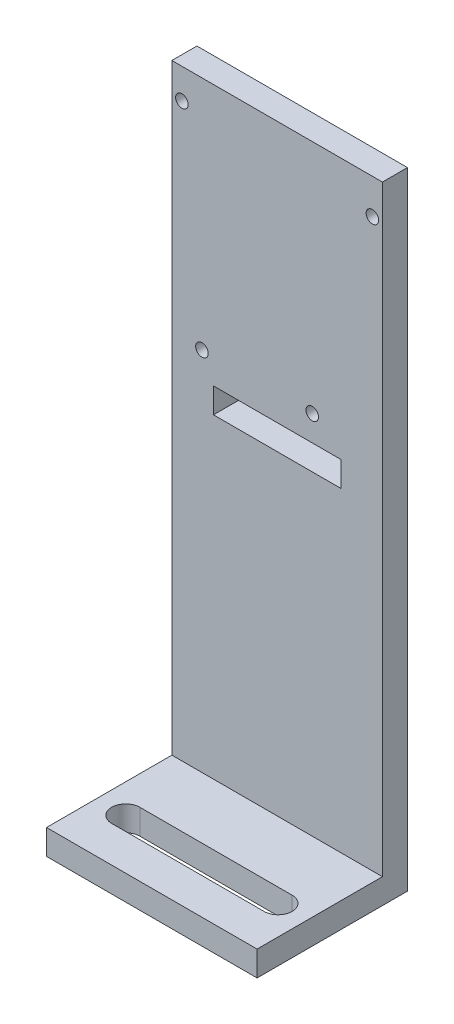
ISO-10303-21;
HEADER;
FILE_DESCRIPTION(('STEP AP214'),'2;1');
FILE_NAME('part.step','',(''),(''),'','','');
FILE_SCHEMA(('AUTOMOTIVE_DESIGN { 1 0 10303 214 1 1 1 1 }'));
ENDSEC;
DATA;
#1=APPLICATION_CONTEXT('core data for automotive mechanical design processes');
#2=APPLICATION_PROTOCOL_DEFINITION('international standard','automotive_design',2000,#1);
#3=PRODUCT_CONTEXT('',#1,'mechanical');
#4=PRODUCT('Part','Part','',(#3));
#5=PRODUCT_RELATED_PRODUCT_CATEGORY('part','',(#4));
#6=PRODUCT_DEFINITION_FORMATION('','',#4);
#7=PRODUCT_DEFINITION_CONTEXT('part definition',#1,'design');
#8=PRODUCT_DEFINITION('design','',#6,#7);
#9=PRODUCT_DEFINITION_SHAPE('','',#8);
#10=(LENGTH_UNIT() NAMED_UNIT(*) SI_UNIT(.MILLI.,.METRE.));
#11=(NAMED_UNIT(*) PLANE_ANGLE_UNIT() SI_UNIT($,.RADIAN.));
#12=(NAMED_UNIT(*) SI_UNIT($,.STERADIAN.) SOLID_ANGLE_UNIT());
#13=UNCERTAINTY_MEASURE_WITH_UNIT(LENGTH_MEASURE(1.E-05),#10,'distance_accuracy_value','');
#14=(GEOMETRIC_REPRESENTATION_CONTEXT(3) GLOBAL_UNCERTAINTY_ASSIGNED_CONTEXT((#13)) GLOBAL_UNIT_ASSIGNED_CONTEXT((#10,
#11,#12)) REPRESENTATION_CONTEXT('',''));
#15=CARTESIAN_POINT('',(0.,0.,0.));
#16=DIRECTION('',(0.,0.,1.));
#17=DIRECTION('',(1.,0.,0.));
#18=AXIS2_PLACEMENT_3D('',#15,#16,#17);
#19=CARTESIAN_POINT('',(0.,0.,6.35));
#20=DIRECTION('',(0.,0.,1.));
#21=DIRECTION('',(1.,0.,0.));
#22=AXIS2_PLACEMENT_3D('',#19,#20,#21);
#23=PLANE('',#22);
#24=DIRECTION('',(-1.,0.,0.));
#25=VECTOR('',#24,1.);
#26=CARTESIAN_POINT('',(-43.7614457831326,-23.0895180722892,6.35));
#27=LINE('',#26,#25);
#28=CARTESIAN_POINT('',(9.57855421686743,-23.0895180722891,6.35));
#29=VERTEX_POINT('',#28);
#30=CARTESIAN_POINT('',(-43.7614457831326,-23.0895180722892,6.35));
#31=VERTEX_POINT('',#30);
#32=EDGE_CURVE('E159',#29,#31,#27,.T.);
#33=ORIENTED_EDGE('',*,*,#32,.F.);
#34=DIRECTION('',(0.,1.,0.));
#35=VECTOR('',#34,1.);
#36=CARTESIAN_POINT('',(9.57855421686741,129.310481927711,6.35));
#37=LINE('',#36,#35);
#38=CARTESIAN_POINT('',(9.57855421686741,129.310481927711,6.35));
#39=VERTEX_POINT('',#38);
#40=EDGE_CURVE('E296',#29,#39,#37,.T.);
#41=ORIENTED_EDGE('',*,*,#40,.T.);
#42=DIRECTION('',(-1.,0.,0.));
#43=VECTOR('',#42,1.);
#44=CARTESIAN_POINT('',(-43.7614457831326,129.310481927711,6.35));
#45=LINE('',#44,#43);
#46=CARTESIAN_POINT('',(-43.7614457831326,129.310481927711,6.35));
#47=VERTEX_POINT('',#46);
#48=EDGE_CURVE('E300',#39,#47,#45,.T.);
#49=ORIENTED_EDGE('',*,*,#48,.T.);
#50=DIRECTION('',(0.,-1.,0.));
#51=VECTOR('',#50,1.);
#52=CARTESIAN_POINT('',(-43.7614457831326,129.310481927711,6.35));
#53=LINE('',#52,#51);
#54=EDGE_CURVE('E293',#47,#31,#53,.T.);
#55=ORIENTED_EDGE('',*,*,#54,.T.);
#56=EDGE_LOOP('',(#33,#41,#49,#55));
#57=FACE_BOUND('',#56,.T.);
#58=DIRECTION('',(0.,-1.,0.));
#59=VECTOR('',#58,1.);
#60=CARTESIAN_POINT('',(-33.2204457831326,63.189063863778,6.35));
#61=LINE('',#60,#59);
#62=CARTESIAN_POINT('',(-33.2204457831326,63.189063863778,6.35));
#63=VERTEX_POINT('',#62);
#64=CARTESIAN_POINT('',(-33.2204457831326,56.839063863778,6.35));
#65=VERTEX_POINT('',#64);
#66=EDGE_CURVE('E216',#63,#65,#61,.T.);
#67=ORIENTED_EDGE('',*,*,#66,.F.);
#68=DIRECTION('',(-1.,0.,0.));
#69=VECTOR('',#68,1.);
#70=CARTESIAN_POINT('',(-33.2204457831326,63.189063863778,6.35));
#71=LINE('',#70,#69);
#72=CARTESIAN_POINT('',(-0.962445783132593,63.189063863778,6.35));
#73=VERTEX_POINT('',#72);
#74=EDGE_CURVE('E222',#73,#63,#71,.T.);
#75=ORIENTED_EDGE('',*,*,#74,.F.);
#76=DIRECTION('',(0.,1.,0.));
#77=VECTOR('',#76,1.);
#78=CARTESIAN_POINT('',(-0.962445783132593,63.189063863778,6.35));
#79=LINE('',#78,#77);
#80=CARTESIAN_POINT('',(-0.962445783132593,56.839063863778,6.35));
#81=VERTEX_POINT('',#80);
#82=EDGE_CURVE('E241',#81,#73,#79,.T.);
#83=ORIENTED_EDGE('',*,*,#82,.F.);
#84=DIRECTION('',(1.,0.,0.));
#85=VECTOR('',#84,1.);
#86=CARTESIAN_POINT('',(-33.2204457831326,56.839063863778,6.35));
#87=LINE('',#86,#85);
#88=EDGE_CURVE('E237',#65,#81,#87,.T.);
#89=ORIENTED_EDGE('',*,*,#88,.F.);
#90=EDGE_LOOP('',(#67,#75,#83,#89));
#91=FACE_BOUND('',#90,.T.);
#92=CARTESIAN_POINT('',(-41.2214457831326,121.690481927711,6.35));
#93=DIRECTION('',(0.,0.,1.));
#94=DIRECTION('',(1.,0.,0.));
#95=AXIS2_PLACEMENT_3D('',#92,#93,#94);
#96=CIRCLE('',#95,1.5875);
#97=CARTESIAN_POINT('',(-39.6339457831326,121.690481927711,6.35));
#98=VERTEX_POINT('',#97);
#99=EDGE_CURVE('E269',#98,#98,#96,.T.);
#100=ORIENTED_EDGE('',*,*,#99,.F.);
#101=EDGE_LOOP('',(#100));
#102=FACE_BOUND('',#101,.T.);
#103=CARTESIAN_POINT('',(-36.1414457831326,69.6204819277108,6.35));
#104=DIRECTION('',(0.,0.,1.));
#105=DIRECTION('',(1.,0.,0.));
#106=AXIS2_PLACEMENT_3D('',#103,#104,#105);
#107=CIRCLE('',#106,1.5875);
#108=CARTESIAN_POINT('',(-34.5539457831326,69.6204819277108,6.35));
#109=VERTEX_POINT('',#108);
#110=EDGE_CURVE('E285',#109,#109,#107,.T.);
#111=ORIENTED_EDGE('',*,*,#110,.F.);
#112=EDGE_LOOP('',(#111));
#113=FACE_BOUND('',#112,.T.);
#114=CARTESIAN_POINT('',(-8.20144578313258,69.6204819277108,6.35));
#115=DIRECTION('',(0.,0.,1.));
#116=DIRECTION('',(1.,0.,0.));
#117=AXIS2_PLACEMENT_3D('',#114,#115,#116);
#118=CIRCLE('',#117,1.5875);
#119=CARTESIAN_POINT('',(-6.61394578313258,69.6204819277108,6.35));
#120=VERTEX_POINT('',#119);
#121=EDGE_CURVE('E277',#120,#120,#118,.T.);
#122=ORIENTED_EDGE('',*,*,#121,.F.);
#123=EDGE_LOOP('',(#122));
#124=FACE_BOUND('',#123,.T.);
#125=CARTESIAN_POINT('',(7.0385542168674,120.420481927711,6.35));
#126=DIRECTION('',(0.,0.,1.));
#127=DIRECTION('',(1.,0.,0.));
#128=AXIS2_PLACEMENT_3D('',#125,#126,#127);
#129=CIRCLE('',#128,1.5875);
#130=CARTESIAN_POINT('',(8.6260542168674,120.420481927711,6.35));
#131=VERTEX_POINT('',#130);
#132=EDGE_CURVE('E261',#131,#131,#129,.T.);
#133=ORIENTED_EDGE('',*,*,#132,.F.);
#134=EDGE_LOOP('',(#133));
#135=FACE_BOUND('',#134,.T.);
#136=ADVANCED_FACE('F41',(#57,#91,#102,#113,#124,#135),#23,.T.);
#137=CARTESIAN_POINT('',(0.,0.,0.));
#138=DIRECTION('',(0.,0.,1.));
#139=DIRECTION('',(1.,0.,0.));
#140=AXIS2_PLACEMENT_3D('',#137,#138,#139);
#141=PLANE('',#140);
#142=DIRECTION('',(-1.,0.,0.));
#143=VECTOR('',#142,1.);
#144=CARTESIAN_POINT('',(-33.2204457831326,63.189063863778,0.));
#145=LINE('',#144,#143);
#146=CARTESIAN_POINT('',(-0.962445783132593,63.189063863778,0.));
#147=VERTEX_POINT('',#146);
#148=CARTESIAN_POINT('',(-33.2204457831326,63.189063863778,0.));
#149=VERTEX_POINT('',#148);
#150=EDGE_CURVE('E230',#147,#149,#145,.T.);
#151=ORIENTED_EDGE('',*,*,#150,.T.);
#152=DIRECTION('',(0.,-1.,0.));
#153=VECTOR('',#152,1.);
#154=CARTESIAN_POINT('',(-33.2204457831326,63.189063863778,0.));
#155=LINE('',#154,#153);
#156=CARTESIAN_POINT('',(-33.2204457831326,56.839063863778,0.));
#157=VERTEX_POINT('',#156);
#158=EDGE_CURVE('E217',#149,#157,#155,.T.);
#159=ORIENTED_EDGE('',*,*,#158,.T.);
#160=DIRECTION('',(1.,0.,0.));
#161=VECTOR('',#160,1.);
#162=CARTESIAN_POINT('',(-33.2204457831326,56.839063863778,0.));
#163=LINE('',#162,#161);
#164=CARTESIAN_POINT('',(-0.962445783132593,56.839063863778,0.));
#165=VERTEX_POINT('',#164);
#166=EDGE_CURVE('E221',#157,#165,#163,.T.);
#167=ORIENTED_EDGE('',*,*,#166,.T.);
#168=DIRECTION('',(0.,1.,0.));
#169=VECTOR('',#168,1.);
#170=CARTESIAN_POINT('',(-0.962445783132593,63.189063863778,0.));
#171=LINE('',#170,#169);
#172=EDGE_CURVE('E226',#165,#147,#171,.T.);
#173=ORIENTED_EDGE('',*,*,#172,.T.);
#174=EDGE_LOOP('',(#151,#159,#167,#173));
#175=FACE_BOUND('',#174,.T.);
#176=DIRECTION('',(0.,-1.,0.));
#177=VECTOR('',#176,1.);
#178=CARTESIAN_POINT('',(-43.7614457831326,129.310481927711,0.));
#179=LINE('',#178,#177);
#180=CARTESIAN_POINT('',(-43.7614457831326,129.310481927711,0.));
#181=VERTEX_POINT('',#180);
#182=CARTESIAN_POINT('',(-43.7614457831326,-29.4395180722892,0.));
#183=VERTEX_POINT('',#182);
#184=EDGE_CURVE('E289',#181,#183,#179,.T.);
#185=ORIENTED_EDGE('',*,*,#184,.F.);
#186=DIRECTION('',(-1.,0.,0.));
#187=VECTOR('',#186,1.);
#188=CARTESIAN_POINT('',(-43.7614457831326,129.310481927711,0.));
#189=LINE('',#188,#187);
#190=CARTESIAN_POINT('',(9.57855421686741,129.310481927711,0.));
#191=VERTEX_POINT('',#190);
#192=EDGE_CURVE('E297',#191,#181,#189,.T.);
#193=ORIENTED_EDGE('',*,*,#192,.F.);
#194=DIRECTION('',(0.,1.,0.));
#195=VECTOR('',#194,1.);
#196=CARTESIAN_POINT('',(9.57855421686741,129.310481927711,0.));
#197=LINE('',#196,#195);
#198=CARTESIAN_POINT('',(9.57855421686743,-29.4395180722892,0.));
#199=VERTEX_POINT('',#198);
#200=EDGE_CURVE('E310',#199,#191,#197,.T.);
#201=ORIENTED_EDGE('',*,*,#200,.F.);
#202=DIRECTION('',(1.,0.,0.));
#203=VECTOR('',#202,1.);
#204=CARTESIAN_POINT('',(-43.7614457831326,-29.4395180722892,0.));
#205=LINE('',#204,#203);
#206=EDGE_CURVE('E307',#183,#199,#205,.T.);
#207=ORIENTED_EDGE('',*,*,#206,.F.);
#208=EDGE_LOOP('',(#185,#193,#201,#207));
#209=FACE_BOUND('',#208,.T.);
#210=CARTESIAN_POINT('',(-36.1414457831326,69.6204819277108,0.));
#211=DIRECTION('',(0.,0.,1.));
#212=DIRECTION('',(1.,0.,0.));
#213=AXIS2_PLACEMENT_3D('',#210,#211,#212);
#214=CIRCLE('',#213,1.5875);
#215=CARTESIAN_POINT('',(-34.5539457831326,69.6204819277108,0.));
#216=VERTEX_POINT('',#215);
#217=EDGE_CURVE('E281',#216,#216,#214,.T.);
#218=ORIENTED_EDGE('',*,*,#217,.T.);
#219=EDGE_LOOP('',(#218));
#220=FACE_BOUND('',#219,.T.);
#221=CARTESIAN_POINT('',(-8.20144578313258,69.6204819277108,0.));
#222=DIRECTION('',(0.,0.,1.));
#223=DIRECTION('',(1.,0.,0.));
#224=AXIS2_PLACEMENT_3D('',#221,#222,#223);
#225=CIRCLE('',#224,1.5875);
#226=CARTESIAN_POINT('',(-6.61394578313258,69.6204819277108,0.));
#227=VERTEX_POINT('',#226);
#228=EDGE_CURVE('E273',#227,#227,#225,.T.);
#229=ORIENTED_EDGE('',*,*,#228,.T.);
#230=EDGE_LOOP('',(#229));
#231=FACE_BOUND('',#230,.T.);
#232=CARTESIAN_POINT('',(-41.2214457831326,121.690481927711,0.));
#233=DIRECTION('',(0.,0.,1.));
#234=DIRECTION('',(1.,0.,0.));
#235=AXIS2_PLACEMENT_3D('',#232,#233,#234);
#236=CIRCLE('',#235,1.5875);
#237=CARTESIAN_POINT('',(-39.6339457831326,121.690481927711,0.));
#238=VERTEX_POINT('',#237);
#239=EDGE_CURVE('E265',#238,#238,#236,.T.);
#240=ORIENTED_EDGE('',*,*,#239,.T.);
#241=EDGE_LOOP('',(#240));
#242=FACE_BOUND('',#241,.T.);
#243=CARTESIAN_POINT('',(7.0385542168674,120.420481927711,0.));
#244=DIRECTION('',(0.,0.,1.));
#245=DIRECTION('',(1.,0.,0.));
#246=AXIS2_PLACEMENT_3D('',#243,#244,#245);
#247=CIRCLE('',#246,1.5875);
#248=CARTESIAN_POINT('',(8.6260542168674,120.420481927711,0.));
#249=VERTEX_POINT('',#248);
#250=EDGE_CURVE('E251',#249,#249,#247,.T.);
#251=ORIENTED_EDGE('',*,*,#250,.T.);
#252=EDGE_LOOP('',(#251));
#253=FACE_BOUND('',#252,.T.);
#254=ADVANCED_FACE('F333',(#175,#209,#220,#231,#242,#253),#141,.F.);
#255=CARTESIAN_POINT('',(-43.7614457831326,129.310481927711,6.35));
#256=DIRECTION('',(1.,0.,0.));
#257=DIRECTION('',(0.,1.,0.));
#258=AXIS2_PLACEMENT_3D('',#255,#256,#257);
#259=PLANE('',#258);
#260=ORIENTED_EDGE('',*,*,#184,.T.);
#261=DIRECTION('',(0.,0.,-1.));
#262=VECTOR('',#261,1.);
#263=CARTESIAN_POINT('',(-43.7614457831326,-29.4395180722892,6.35));
#264=LINE('',#263,#262);
#265=CARTESIAN_POINT('',(-43.7614457831326,-29.4395180722892,38.1));
#266=VERTEX_POINT('',#265);
#267=EDGE_CURVE('E11',#266,#183,#264,.T.);
#268=ORIENTED_EDGE('',*,*,#267,.F.);
#269=DIRECTION('',(0.,-1.,0.));
#270=VECTOR('',#269,1.);
#271=CARTESIAN_POINT('',(-43.7614457831326,-29.4395180722892,38.1));
#272=LINE('',#271,#270);
#273=CARTESIAN_POINT('',(-43.7614457831326,-23.0895180722892,38.1));
#274=VERTEX_POINT('',#273);
#275=EDGE_CURVE('E191',#274,#266,#272,.T.);
#276=ORIENTED_EDGE('',*,*,#275,.F.);
#277=DIRECTION('',(0.,0.,-1.));
#278=VECTOR('',#277,1.);
#279=CARTESIAN_POINT('',(-43.7614457831326,-23.0895180722892,38.1));
#280=LINE('',#279,#278);
#281=EDGE_CURVE('E205',#274,#31,#280,.T.);
#282=ORIENTED_EDGE('',*,*,#281,.T.);
#283=ORIENTED_EDGE('',*,*,#54,.F.);
#284=DIRECTION('',(0.,0.,-1.));
#285=VECTOR('',#284,1.);
#286=CARTESIAN_POINT('',(-43.7614457831326,129.310481927711,6.35));
#287=LINE('',#286,#285);
#288=EDGE_CURVE('E303',#47,#181,#287,.T.);
#289=ORIENTED_EDGE('',*,*,#288,.T.);
#290=EDGE_LOOP('',(#260,#268,#276,#282,#283,#289));
#291=FACE_BOUND('',#290,.T.);
#292=ADVANCED_FACE('F43',(#291),#259,.F.);
#293=CARTESIAN_POINT('',(-43.7614457831326,-29.4395180722892,6.35));
#294=DIRECTION('',(0.,1.,0.));
#295=DIRECTION('',(0.,0.,1.));
#296=AXIS2_PLACEMENT_3D('',#293,#294,#295);
#297=PLANE('',#296);
#298=DIRECTION('',(1.,0.,0.));
#299=VECTOR('',#298,1.);
#300=CARTESIAN_POINT('',(-36.3954457831326,-29.4395180722892,21.844));
#301=LINE('',#300,#299);
#302=CARTESIAN_POINT('',(-36.3954457831326,-29.4395180722892,21.844));
#303=VERTEX_POINT('',#302);
#304=CARTESIAN_POINT('',(2.21255421686743,-29.4395180722892,21.844));
#305=VERTEX_POINT('',#304);
#306=EDGE_CURVE('E165',#303,#305,#301,.T.);
#307=ORIENTED_EDGE('',*,*,#306,.F.);
#308=CARTESIAN_POINT('',(-36.3954457831326,-29.4395180722892,25.4));
#309=DIRECTION('',(0.,1.,0.));
#310=DIRECTION('',(0.,0.,1.));
#311=AXIS2_PLACEMENT_3D('',#308,#309,#310);
#312=CIRCLE('',#311,3.55600000000001);
#313=CARTESIAN_POINT('',(-36.3954457831326,-29.4395180722892,28.956));
#314=VERTEX_POINT('',#313);
#315=EDGE_CURVE('E145',#314,#303,#312,.F.);
#316=ORIENTED_EDGE('',*,*,#315,.F.);
#317=DIRECTION('',(-1.,0.,0.));
#318=VECTOR('',#317,1.);
#319=CARTESIAN_POINT('',(-36.3954457831326,-29.4395180722892,28.956));
#320=LINE('',#319,#318);
#321=CARTESIAN_POINT('',(2.21255421686743,-29.4395180722892,28.956));
#322=VERTEX_POINT('',#321);
#323=EDGE_CURVE('E155',#322,#314,#320,.T.);
#324=ORIENTED_EDGE('',*,*,#323,.F.);
#325=CARTESIAN_POINT('',(2.21255421686743,-29.4395180722892,25.4));
#326=DIRECTION('',(0.,1.,0.));
#327=DIRECTION('',(0.,0.,1.));
#328=AXIS2_PLACEMENT_3D('',#325,#326,#327);
#329=CIRCLE('',#328,3.556);
#330=EDGE_CURVE('E57',#305,#322,#329,.F.);
#331=ORIENTED_EDGE('',*,*,#330,.F.);
#332=EDGE_LOOP('',(#307,#316,#324,#331));
#333=FACE_BOUND('',#332,.T.);
#334=ORIENTED_EDGE('',*,*,#206,.T.);
#335=DIRECTION('',(0.,0.,-1.));
#336=VECTOR('',#335,1.);
#337=CARTESIAN_POINT('',(9.57855421686743,-29.4395180722892,6.35));
#338=LINE('',#337,#336);
#339=CARTESIAN_POINT('',(9.57855421686743,-29.4395180722892,38.1));
#340=VERTEX_POINT('',#339);
#341=EDGE_CURVE('E50',#340,#199,#338,.T.);
#342=ORIENTED_EDGE('',*,*,#341,.F.);
#343=DIRECTION('',(1.,0.,0.));
#344=VECTOR('',#343,1.);
#345=CARTESIAN_POINT('',(-43.7614457831326,-29.4395180722892,38.1));
#346=LINE('',#345,#344);
#347=EDGE_CURVE('E195',#266,#340,#346,.T.);
#348=ORIENTED_EDGE('',*,*,#347,.F.);
#349=ORIENTED_EDGE('',*,*,#267,.T.);
#350=EDGE_LOOP('',(#334,#342,#348,#349));
#351=FACE_BOUND('',#350,.T.);
#352=ADVANCED_FACE('F162',(#333,#351),#297,.F.);
#353=CARTESIAN_POINT('',(9.57855421686741,129.310481927711,6.35));
#354=DIRECTION('',(-1.,0.,0.));
#355=DIRECTION('',(0.,-1.,0.));
#356=AXIS2_PLACEMENT_3D('',#353,#354,#355);
#357=PLANE('',#356);
#358=ORIENTED_EDGE('',*,*,#200,.T.);
#359=DIRECTION('',(0.,0.,-1.));
#360=VECTOR('',#359,1.);
#361=CARTESIAN_POINT('',(9.57855421686741,129.310481927711,6.35));
#362=LINE('',#361,#360);
#363=EDGE_CURVE('E318',#39,#191,#362,.T.);
#364=ORIENTED_EDGE('',*,*,#363,.F.);
#365=ORIENTED_EDGE('',*,*,#40,.F.);
#366=DIRECTION('',(0.,0.,-1.));
#367=VECTOR('',#366,1.);
#368=CARTESIAN_POINT('',(9.57855421686743,-23.0895180722892,38.1));
#369=LINE('',#368,#367);
#370=CARTESIAN_POINT('',(9.57855421686743,-23.0895180722892,38.1));
#371=VERTEX_POINT('',#370);
#372=EDGE_CURVE('E212',#371,#29,#369,.T.);
#373=ORIENTED_EDGE('',*,*,#372,.F.);
#374=DIRECTION('',(0.,1.,0.));
#375=VECTOR('',#374,1.);
#376=CARTESIAN_POINT('',(9.57855421686743,-29.4395180722892,38.1));
#377=LINE('',#376,#375);
#378=EDGE_CURVE('E199',#340,#371,#377,.T.);
#379=ORIENTED_EDGE('',*,*,#378,.F.);
#380=ORIENTED_EDGE('',*,*,#341,.T.);
#381=EDGE_LOOP('',(#358,#364,#365,#373,#379,#380));
#382=FACE_BOUND('',#381,.T.);
#383=ADVANCED_FACE('F326',(#382),#357,.F.);
#384=CARTESIAN_POINT('',(-43.7614457831326,129.310481927711,6.35));
#385=DIRECTION('',(0.,-1.,0.));
#386=DIRECTION('',(0.,0.,-1.));
#387=AXIS2_PLACEMENT_3D('',#384,#385,#386);
#388=PLANE('',#387);
#389=ORIENTED_EDGE('',*,*,#192,.T.);
#390=ORIENTED_EDGE('',*,*,#288,.F.);
#391=ORIENTED_EDGE('',*,*,#48,.F.);
#392=ORIENTED_EDGE('',*,*,#363,.T.);
#393=EDGE_LOOP('',(#389,#390,#391,#392));
#394=FACE_BOUND('',#393,.T.);
#395=ADVANCED_FACE('F337',(#394),#388,.F.);
#396=CARTESIAN_POINT('',(-36.1414457831326,69.6204819277108,6.35));
#397=DIRECTION('',(0.,0.,-1.));
#398=DIRECTION('',(-1.,0.,0.));
#399=AXIS2_PLACEMENT_3D('',#396,#397,#398);
#400=CYLINDRICAL_SURFACE('',#399,1.5875);
#401=ORIENTED_EDGE('',*,*,#110,.T.);
#402=EDGE_LOOP('',(#401));
#403=FACE_BOUND('',#402,.T.);
#404=ORIENTED_EDGE('',*,*,#217,.F.);
#405=EDGE_LOOP('',(#404));
#406=FACE_BOUND('',#405,.T.);
#407=ADVANCED_FACE('F365',(#403,#406),#400,.F.);
#408=CARTESIAN_POINT('',(-8.20144578313258,69.6204819277108,6.35));
#409=DIRECTION('',(0.,0.,-1.));
#410=DIRECTION('',(-1.,0.,0.));
#411=AXIS2_PLACEMENT_3D('',#408,#409,#410);
#412=CYLINDRICAL_SURFACE('',#411,1.5875);
#413=ORIENTED_EDGE('',*,*,#121,.T.);
#414=EDGE_LOOP('',(#413));
#415=FACE_BOUND('',#414,.T.);
#416=ORIENTED_EDGE('',*,*,#228,.F.);
#417=EDGE_LOOP('',(#416));
#418=FACE_BOUND('',#417,.T.);
#419=ADVANCED_FACE('F372',(#415,#418),#412,.F.);
#420=CARTESIAN_POINT('',(-41.2214457831326,121.690481927711,6.35));
#421=DIRECTION('',(0.,0.,-1.));
#422=DIRECTION('',(-1.,0.,0.));
#423=AXIS2_PLACEMENT_3D('',#420,#421,#422);
#424=CYLINDRICAL_SURFACE('',#423,1.5875);
#425=ORIENTED_EDGE('',*,*,#99,.T.);
#426=EDGE_LOOP('',(#425));
#427=FACE_BOUND('',#426,.T.);
#428=ORIENTED_EDGE('',*,*,#239,.F.);
#429=EDGE_LOOP('',(#428));
#430=FACE_BOUND('',#429,.T.);
#431=ADVANCED_FACE('F377',(#427,#430),#424,.F.);
#432=CARTESIAN_POINT('',(7.0385542168674,120.420481927711,6.35));
#433=DIRECTION('',(0.,0.,-1.));
#434=DIRECTION('',(-1.,0.,0.));
#435=AXIS2_PLACEMENT_3D('',#432,#433,#434);
#436=CYLINDRICAL_SURFACE('',#435,1.5875);
#437=ORIENTED_EDGE('',*,*,#132,.T.);
#438=EDGE_LOOP('',(#437));
#439=FACE_BOUND('',#438,.T.);
#440=ORIENTED_EDGE('',*,*,#250,.F.);
#441=EDGE_LOOP('',(#440));
#442=FACE_BOUND('',#441,.T.);
#443=ADVANCED_FACE('F389',(#439,#442),#436,.F.);
#444=CARTESIAN_POINT('',(-33.2204457831326,63.189063863778,0.));
#445=DIRECTION('',(-1.,0.,0.));
#446=DIRECTION('',(0.,0.,1.));
#447=AXIS2_PLACEMENT_3D('',#444,#445,#446);
#448=PLANE('',#447);
#449=ORIENTED_EDGE('',*,*,#66,.T.);
#450=DIRECTION('',(0.,0.,1.));
#451=VECTOR('',#450,1.);
#452=CARTESIAN_POINT('',(-33.2204457831326,56.839063863778,0.));
#453=LINE('',#452,#451);
#454=EDGE_CURVE('E234',#157,#65,#453,.T.);
#455=ORIENTED_EDGE('',*,*,#454,.F.);
#456=ORIENTED_EDGE('',*,*,#158,.F.);
#457=DIRECTION('',(0.,0.,1.));
#458=VECTOR('',#457,1.);
#459=CARTESIAN_POINT('',(-33.2204457831326,63.189063863778,0.));
#460=LINE('',#459,#458);
#461=EDGE_CURVE('E248',#149,#63,#460,.T.);
#462=ORIENTED_EDGE('',*,*,#461,.T.);
#463=EDGE_LOOP('',(#449,#455,#456,#462));
#464=FACE_BOUND('',#463,.T.);
#465=ADVANCED_FACE('F391',(#464),#448,.F.);
#466=CARTESIAN_POINT('',(-33.2204457831326,63.189063863778,0.));
#467=DIRECTION('',(0.,1.,0.));
#468=DIRECTION('',(0.,0.,1.));
#469=AXIS2_PLACEMENT_3D('',#466,#467,#468);
#470=PLANE('',#469);
#471=ORIENTED_EDGE('',*,*,#74,.T.);
#472=ORIENTED_EDGE('',*,*,#461,.F.);
#473=ORIENTED_EDGE('',*,*,#150,.F.);
#474=DIRECTION('',(0.,0.,1.));
#475=VECTOR('',#474,1.);
#476=CARTESIAN_POINT('',(-0.962445783132593,63.189063863778,0.));
#477=LINE('',#476,#475);
#478=EDGE_CURVE('E252',#147,#73,#477,.T.);
#479=ORIENTED_EDGE('',*,*,#478,.T.);
#480=EDGE_LOOP('',(#471,#472,#473,#479));
#481=FACE_BOUND('',#480,.T.);
#482=ADVANCED_FACE('F398',(#481),#470,.F.);
#483=CARTESIAN_POINT('',(-0.962445783132593,63.189063863778,0.));
#484=DIRECTION('',(1.,0.,0.));
#485=DIRECTION('',(0.,0.,-1.));
#486=AXIS2_PLACEMENT_3D('',#483,#484,#485);
#487=PLANE('',#486);
#488=ORIENTED_EDGE('',*,*,#82,.T.);
#489=ORIENTED_EDGE('',*,*,#478,.F.);
#490=ORIENTED_EDGE('',*,*,#172,.F.);
#491=DIRECTION('',(0.,0.,1.));
#492=VECTOR('',#491,1.);
#493=CARTESIAN_POINT('',(-0.962445783132593,56.839063863778,0.));
#494=LINE('',#493,#492);
#495=EDGE_CURVE('E255',#165,#81,#494,.T.);
#496=ORIENTED_EDGE('',*,*,#495,.T.);
#497=EDGE_LOOP('',(#488,#489,#490,#496));
#498=FACE_BOUND('',#497,.T.);
#499=ADVANCED_FACE('F407',(#498),#487,.F.);
#500=CARTESIAN_POINT('',(-33.2204457831326,56.839063863778,0.));
#501=DIRECTION('',(0.,-1.,0.));
#502=DIRECTION('',(1.,0.,0.));
#503=AXIS2_PLACEMENT_3D('',#500,#501,#502);
#504=PLANE('',#503);
#505=ORIENTED_EDGE('',*,*,#88,.T.);
#506=ORIENTED_EDGE('',*,*,#495,.F.);
#507=ORIENTED_EDGE('',*,*,#166,.F.);
#508=ORIENTED_EDGE('',*,*,#454,.T.);
#509=EDGE_LOOP('',(#505,#506,#507,#508));
#510=FACE_BOUND('',#509,.T.);
#511=ADVANCED_FACE('F404',(#510),#504,.F.);
#512=CARTESIAN_POINT('',(-43.7614457831326,-23.0895180722892,38.1));
#513=DIRECTION('',(0.,-1.,0.));
#514=DIRECTION('',(0.,0.,-1.));
#515=AXIS2_PLACEMENT_3D('',#512,#513,#514);
#516=PLANE('',#515);
#517=DIRECTION('',(1.,0.,0.));
#518=VECTOR('',#517,1.);
#519=CARTESIAN_POINT('',(-36.3954457831326,-23.0895180722892,28.956));
#520=LINE('',#519,#518);
#521=CARTESIAN_POINT('',(-36.3954457831326,-23.0895180722892,28.956));
#522=VERTEX_POINT('',#521);
#523=CARTESIAN_POINT('',(2.21255421686743,-23.0895180722892,28.956));
#524=VERTEX_POINT('',#523);
#525=EDGE_CURVE('E170',#522,#524,#520,.T.);
#526=ORIENTED_EDGE('',*,*,#525,.F.);
#527=CARTESIAN_POINT('',(-36.3954457831326,-23.0895180722892,25.4));
#528=DIRECTION('',(0.,1.,0.));
#529=DIRECTION('',(0.,0.,1.));
#530=AXIS2_PLACEMENT_3D('',#527,#528,#529);
#531=CIRCLE('',#530,3.55600000000001);
#532=CARTESIAN_POINT('',(-36.3954457831326,-23.0895180722892,21.844));
#533=VERTEX_POINT('',#532);
#534=EDGE_CURVE('E65',#533,#522,#531,.T.);
#535=ORIENTED_EDGE('',*,*,#534,.F.);
#536=DIRECTION('',(-1.,0.,0.));
#537=VECTOR('',#536,1.);
#538=CARTESIAN_POINT('',(-36.3954457831326,-23.0895180722892,21.844));
#539=LINE('',#538,#537);
#540=CARTESIAN_POINT('',(2.21255421686743,-23.0895180722892,21.844));
#541=VERTEX_POINT('',#540);
#542=EDGE_CURVE('E152',#541,#533,#539,.T.);
#543=ORIENTED_EDGE('',*,*,#542,.F.);
#544=CARTESIAN_POINT('',(2.21255421686743,-23.0895180722892,25.4));
#545=DIRECTION('',(0.,1.,0.));
#546=DIRECTION('',(0.,0.,1.));
#547=AXIS2_PLACEMENT_3D('',#544,#545,#546);
#548=CIRCLE('',#547,3.556);
#549=EDGE_CURVE('E177',#524,#541,#548,.T.);
#550=ORIENTED_EDGE('',*,*,#549,.F.);
#551=EDGE_LOOP('',(#526,#535,#543,#550));
#552=FACE_BOUND('',#551,.T.);
#553=ORIENTED_EDGE('',*,*,#32,.T.);
#554=ORIENTED_EDGE('',*,*,#281,.F.);
#555=DIRECTION('',(-1.,0.,0.));
#556=VECTOR('',#555,1.);
#557=CARTESIAN_POINT('',(-43.7614457831326,-23.0895180722892,38.1));
#558=LINE('',#557,#556);
#559=EDGE_CURVE('E202',#371,#274,#558,.T.);
#560=ORIENTED_EDGE('',*,*,#559,.F.);
#561=ORIENTED_EDGE('',*,*,#372,.T.);
#562=EDGE_LOOP('',(#553,#554,#560,#561));
#563=FACE_BOUND('',#562,.T.);
#564=ADVANCED_FACE('F347',(#552,#563),#516,.F.);
#565=CARTESIAN_POINT('',(0.,0.,38.1));
#566=DIRECTION('',(0.,0.,-1.));
#567=DIRECTION('',(-1.,0.,0.));
#568=AXIS2_PLACEMENT_3D('',#565,#566,#567);
#569=PLANE('',#568);
#570=ORIENTED_EDGE('',*,*,#275,.T.);
#571=ORIENTED_EDGE('',*,*,#347,.T.);
#572=ORIENTED_EDGE('',*,*,#378,.T.);
#573=ORIENTED_EDGE('',*,*,#559,.T.);
#574=EDGE_LOOP('',(#570,#571,#572,#573));
#575=FACE_BOUND('',#574,.T.);
#576=ADVANCED_FACE('F350',(#575),#569,.F.);
#577=CARTESIAN_POINT('',(-36.3954457831326,-29.4405180722892,25.4));
#578=DIRECTION('',(0.,1.,0.));
#579=DIRECTION('',(0.,0.,1.));
#580=AXIS2_PLACEMENT_3D('',#577,#578,#579);
#581=CYLINDRICAL_SURFACE('',#580,3.55600000000001);
#582=ORIENTED_EDGE('',*,*,#315,.T.);
#583=DIRECTION('',(0.,1.,0.));
#584=VECTOR('',#583,1.);
#585=CARTESIAN_POINT('',(-36.3954457831326,-29.4405180722892,21.844));
#586=LINE('',#585,#584);
#587=EDGE_CURVE('E160',#303,#533,#586,.T.);
#588=ORIENTED_EDGE('',*,*,#587,.T.);
#589=ORIENTED_EDGE('',*,*,#534,.T.);
#590=DIRECTION('',(0.,1.,0.));
#591=VECTOR('',#590,1.);
#592=CARTESIAN_POINT('',(-36.3954457831326,-29.4405180722892,28.956));
#593=LINE('',#592,#591);
#594=EDGE_CURVE('E141',#314,#522,#593,.T.);
#595=ORIENTED_EDGE('',*,*,#594,.F.);
#596=EDGE_LOOP('',(#582,#588,#589,#595));
#597=FACE_BOUND('',#596,.T.);
#598=ADVANCED_FACE('F143',(#597),#581,.F.);
#599=CARTESIAN_POINT('',(-36.3954457831326,-29.4405180722892,21.844));
#600=DIRECTION('',(0.,0.,-1.));
#601=DIRECTION('',(-1.,0.,0.));
#602=AXIS2_PLACEMENT_3D('',#599,#600,#601);
#603=PLANE('',#602);
#604=ORIENTED_EDGE('',*,*,#306,.T.);
#605=DIRECTION('',(0.,1.,0.));
#606=VECTOR('',#605,1.);
#607=CARTESIAN_POINT('',(2.21255421686743,-29.4405180722892,21.844));
#608=LINE('',#607,#606);
#609=EDGE_CURVE('E186',#305,#541,#608,.T.);
#610=ORIENTED_EDGE('',*,*,#609,.T.);
#611=ORIENTED_EDGE('',*,*,#542,.T.);
#612=ORIENTED_EDGE('',*,*,#587,.F.);
#613=EDGE_LOOP('',(#604,#610,#611,#612));
#614=FACE_BOUND('',#613,.T.);
#615=ADVANCED_FACE('F422',(#614),#603,.F.);
#616=CARTESIAN_POINT('',(2.21255421686743,-29.4405180722892,25.4));
#617=DIRECTION('',(0.,1.,0.));
#618=DIRECTION('',(0.,0.,1.));
#619=AXIS2_PLACEMENT_3D('',#616,#617,#618);
#620=CYLINDRICAL_SURFACE('',#619,3.556);
#621=ORIENTED_EDGE('',*,*,#330,.T.);
#622=DIRECTION('',(0.,1.,0.));
#623=VECTOR('',#622,1.);
#624=CARTESIAN_POINT('',(2.21255421686743,-29.4405180722892,28.956));
#625=LINE('',#624,#623);
#626=EDGE_CURVE('E151',#322,#524,#625,.T.);
#627=ORIENTED_EDGE('',*,*,#626,.T.);
#628=ORIENTED_EDGE('',*,*,#549,.T.);
#629=ORIENTED_EDGE('',*,*,#609,.F.);
#630=EDGE_LOOP('',(#621,#627,#628,#629));
#631=FACE_BOUND('',#630,.T.);
#632=ADVANCED_FACE('F425',(#631),#620,.F.);
#633=CARTESIAN_POINT('',(-36.3954457831326,-29.4405180722892,28.956));
#634=DIRECTION('',(0.,0.,1.));
#635=DIRECTION('',(1.,0.,0.));
#636=AXIS2_PLACEMENT_3D('',#633,#634,#635);
#637=PLANE('',#636);
#638=ORIENTED_EDGE('',*,*,#323,.T.);
#639=ORIENTED_EDGE('',*,*,#594,.T.);
#640=ORIENTED_EDGE('',*,*,#525,.T.);
#641=ORIENTED_EDGE('',*,*,#626,.F.);
#642=EDGE_LOOP('',(#638,#639,#640,#641));
#643=FACE_BOUND('',#642,.T.);
#644=ADVANCED_FACE('F156',(#643),#637,.F.);
#645=CLOSED_SHELL('',(#136,#254,#292,#352,#383,#395,#407,#419,#431,#443,#465,#482,#499,#511,
#564,#576,#598,#615,#632,#644));
#646=MANIFOLD_SOLID_BREP('B2',#645);
#647=ADVANCED_BREP_SHAPE_REPRESENTATION('',(#18,#646),#14);
#648=SHAPE_DEFINITION_REPRESENTATION(#9,#647);
ENDSEC;
END-ISO-10303-21;
